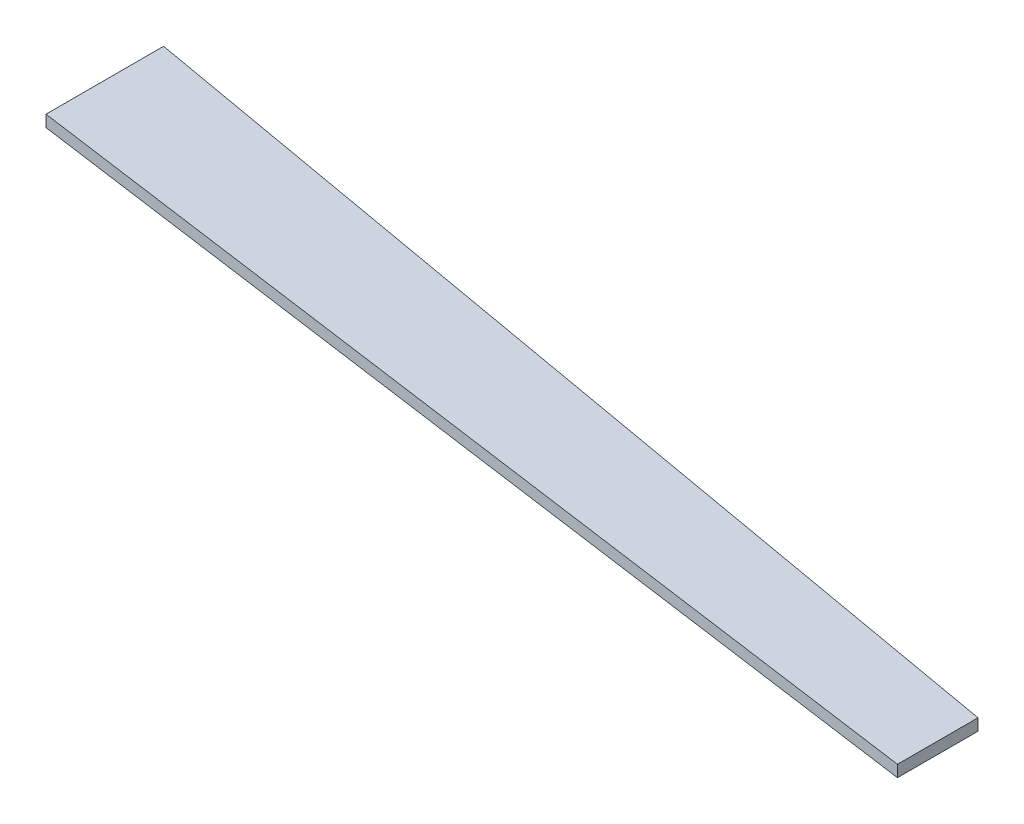
ISO-10303-21;
HEADER;
FILE_DESCRIPTION(('STEP AP214'),'2;1');
FILE_NAME('part.step','',(''),(''),'','','');
FILE_SCHEMA(('AUTOMOTIVE_DESIGN { 1 0 10303 214 1 1 1 1 }'));
ENDSEC;
DATA;
#1=APPLICATION_CONTEXT('core data for automotive mechanical design processes');
#2=APPLICATION_PROTOCOL_DEFINITION('international standard','automotive_design',2000,#1);
#3=PRODUCT_CONTEXT('',#1,'mechanical');
#4=PRODUCT('Part','Part','',(#3));
#5=PRODUCT_RELATED_PRODUCT_CATEGORY('part','',(#4));
#6=PRODUCT_DEFINITION_FORMATION('','',#4);
#7=PRODUCT_DEFINITION_CONTEXT('part definition',#1,'design');
#8=PRODUCT_DEFINITION('design','',#6,#7);
#9=PRODUCT_DEFINITION_SHAPE('','',#8);
#10=(LENGTH_UNIT() NAMED_UNIT(*) SI_UNIT(.MILLI.,.METRE.));
#11=(NAMED_UNIT(*) PLANE_ANGLE_UNIT() SI_UNIT($,.RADIAN.));
#12=(NAMED_UNIT(*) SI_UNIT($,.STERADIAN.) SOLID_ANGLE_UNIT());
#13=UNCERTAINTY_MEASURE_WITH_UNIT(LENGTH_MEASURE(1.E-05),#10,'distance_accuracy_value','');
#14=(GEOMETRIC_REPRESENTATION_CONTEXT(3) GLOBAL_UNCERTAINTY_ASSIGNED_CONTEXT((#13)) GLOBAL_UNIT_ASSIGNED_CONTEXT((#10,
#11,#12)) REPRESENTATION_CONTEXT('',''));
#15=CARTESIAN_POINT('',(0.,0.,0.));
#16=DIRECTION('',(0.,0.,1.));
#17=DIRECTION('',(1.,0.,0.));
#18=AXIS2_PLACEMENT_3D('',#15,#16,#17);
#19=CARTESIAN_POINT('',(104.506252189045,2.,10.3571872638177));
#20=DIRECTION('',(0.137536260349235,0.,-0.990496732497966));
#21=DIRECTION('',(-0.990496732497966,0.,-0.137536260349235));
#22=AXIS2_PLACEMENT_3D('',#19,#20,#21);
#23=PLANE('',#22);
#24=DIRECTION('',(0.990496732497966,0.,0.137536260349235));
#25=VECTOR('',#24,1.);
#26=CARTESIAN_POINT('',(104.506252189045,0.,10.3571872638177));
#27=LINE('',#26,#25);
#28=CARTESIAN_POINT('',(-65.4912621359223,0.,-13.2479611650485));
#29=VERTEX_POINT('',#28);
#30=CARTESIAN_POINT('',(104.506252189045,0.,10.3571872638177));
#31=VERTEX_POINT('',#30);
#32=EDGE_CURVE('E98',#29,#31,#27,.T.);
#33=ORIENTED_EDGE('',*,*,#32,.T.);
#34=DIRECTION('',(0.,-1.,0.));
#35=VECTOR('',#34,1.);
#36=CARTESIAN_POINT('',(104.506252189045,2.,10.3571872638177));
#37=LINE('',#36,#35);
#38=CARTESIAN_POINT('',(104.506252189045,2.,10.3571872638177));
#39=VERTEX_POINT('',#38);
#40=EDGE_CURVE('E11',#39,#31,#37,.T.);
#41=ORIENTED_EDGE('',*,*,#40,.F.);
#42=DIRECTION('',(0.990496732497966,0.,0.137536260349235));
#43=VECTOR('',#42,1.);
#44=CARTESIAN_POINT('',(104.506252189045,2.,10.3571872638177));
#45=LINE('',#44,#43);
#46=CARTESIAN_POINT('',(-65.4912621359223,2.,-13.2479611650485));
#47=VERTEX_POINT('',#46);
#48=EDGE_CURVE('E86',#47,#39,#45,.T.);
#49=ORIENTED_EDGE('',*,*,#48,.F.);
#50=DIRECTION('',(0.,-1.,0.));
#51=VECTOR('',#50,1.);
#52=CARTESIAN_POINT('',(-65.4912621359223,2.,-13.2479611650485));
#53=LINE('',#52,#51);
#54=EDGE_CURVE('E94',#47,#29,#53,.T.);
#55=ORIENTED_EDGE('',*,*,#54,.T.);
#56=EDGE_LOOP('',(#33,#41,#49,#55));
#57=FACE_BOUND('',#56,.T.);
#58=ADVANCED_FACE('F35',(#57),#23,.F.);
#59=CARTESIAN_POINT('',(104.506252189045,2.,-3.49281273618234));
#60=DIRECTION('',(-1.,0.,0.));
#61=DIRECTION('',(0.,0.,1.));
#62=AXIS2_PLACEMENT_3D('',#59,#60,#61);
#63=PLANE('',#62);
#64=DIRECTION('',(0.,0.,-1.));
#65=VECTOR('',#64,1.);
#66=CARTESIAN_POINT('',(104.506252189045,0.,-3.49281273618234));
#67=LINE('',#66,#65);
#68=CARTESIAN_POINT('',(104.506252189045,0.,-3.49281273618234));
#69=VERTEX_POINT('',#68);
#70=EDGE_CURVE('E90',#31,#69,#67,.T.);
#71=ORIENTED_EDGE('',*,*,#70,.T.);
#72=DIRECTION('',(0.,-1.,0.));
#73=VECTOR('',#72,1.);
#74=CARTESIAN_POINT('',(104.506252189045,2.,-3.49281273618234));
#75=LINE('',#74,#73);
#76=CARTESIAN_POINT('',(104.506252189045,2.,-3.49281273618234));
#77=VERTEX_POINT('',#76);
#78=EDGE_CURVE('E43',#77,#69,#75,.T.);
#79=ORIENTED_EDGE('',*,*,#78,.F.);
#80=DIRECTION('',(0.,0.,-1.));
#81=VECTOR('',#80,1.);
#82=CARTESIAN_POINT('',(104.506252189045,2.,-3.49281273618234));
#83=LINE('',#82,#81);
#84=EDGE_CURVE('E81',#39,#77,#83,.T.);
#85=ORIENTED_EDGE('',*,*,#84,.F.);
#86=ORIENTED_EDGE('',*,*,#40,.T.);
#87=EDGE_LOOP('',(#71,#79,#85,#86));
#88=FACE_BOUND('',#87,.T.);
#89=ADVANCED_FACE('F89',(#88),#63,.F.);
#90=CARTESIAN_POINT('',(-65.4912621359223,2.,-33.4679611650485));
#91=DIRECTION('',(-0.173648177666934,0.,0.984807753012207));
#92=DIRECTION('',(0.984807753012208,0.,0.173648177666934));
#93=AXIS2_PLACEMENT_3D('',#90,#91,#92);
#94=PLANE('',#93);
#95=DIRECTION('',(-0.984807753012207,0.,-0.173648177666934));
#96=VECTOR('',#95,1.);
#97=CARTESIAN_POINT('',(-65.4912621359223,0.,-33.4679611650485));
#98=LINE('',#97,#96);
#99=CARTESIAN_POINT('',(-65.4912621359223,0.,-33.4679611650485));
#100=VERTEX_POINT('',#99);
#101=EDGE_CURVE('E68',#69,#100,#98,.T.);
#102=ORIENTED_EDGE('',*,*,#101,.T.);
#103=DIRECTION('',(0.,-1.,0.));
#104=VECTOR('',#103,1.);
#105=CARTESIAN_POINT('',(-65.4912621359223,2.,-33.4679611650485));
#106=LINE('',#105,#104);
#107=CARTESIAN_POINT('',(-65.4912621359223,2.,-33.4679611650485));
#108=VERTEX_POINT('',#107);
#109=EDGE_CURVE('E91',#108,#100,#106,.T.);
#110=ORIENTED_EDGE('',*,*,#109,.F.);
#111=DIRECTION('',(-0.984807753012207,0.,-0.173648177666934));
#112=VECTOR('',#111,1.);
#113=CARTESIAN_POINT('',(-65.4912621359223,2.,-33.4679611650485));
#114=LINE('',#113,#112);
#115=EDGE_CURVE('E84',#77,#108,#114,.T.);
#116=ORIENTED_EDGE('',*,*,#115,.F.);
#117=ORIENTED_EDGE('',*,*,#78,.T.);
#118=EDGE_LOOP('',(#102,#110,#116,#117));
#119=FACE_BOUND('',#118,.T.);
#120=ADVANCED_FACE('F92',(#119),#94,.F.);
#121=CARTESIAN_POINT('',(-65.4912621359223,2.,-13.2479611650485));
#122=DIRECTION('',(1.,0.,0.));
#123=DIRECTION('',(0.,0.,-1.));
#124=AXIS2_PLACEMENT_3D('',#121,#122,#123);
#125=PLANE('',#124);
#126=DIRECTION('',(0.,0.,1.));
#127=VECTOR('',#126,1.);
#128=CARTESIAN_POINT('',(-65.4912621359223,0.,-13.2479611650485));
#129=LINE('',#128,#127);
#130=EDGE_CURVE('E74',#100,#29,#129,.T.);
#131=ORIENTED_EDGE('',*,*,#130,.T.);
#132=ORIENTED_EDGE('',*,*,#54,.F.);
#133=DIRECTION('',(0.,0.,1.));
#134=VECTOR('',#133,1.);
#135=CARTESIAN_POINT('',(-65.4912621359223,2.,-13.2479611650485));
#136=LINE('',#135,#134);
#137=EDGE_CURVE('E51',#108,#47,#136,.T.);
#138=ORIENTED_EDGE('',*,*,#137,.F.);
#139=ORIENTED_EDGE('',*,*,#109,.T.);
#140=EDGE_LOOP('',(#131,#132,#138,#139));
#141=FACE_BOUND('',#140,.T.);
#142=ADVANCED_FACE('F105',(#141),#125,.F.);
#143=CARTESIAN_POINT('',(0.,2.,0.));
#144=DIRECTION('',(0.,-1.,0.));
#145=DIRECTION('',(0.,0.,-1.));
#146=AXIS2_PLACEMENT_3D('',#143,#144,#145);
#147=PLANE('',#146);
#148=ORIENTED_EDGE('',*,*,#48,.T.);
#149=ORIENTED_EDGE('',*,*,#84,.T.);
#150=ORIENTED_EDGE('',*,*,#115,.T.);
#151=ORIENTED_EDGE('',*,*,#137,.T.);
#152=EDGE_LOOP('',(#148,#149,#150,#151));
#153=FACE_BOUND('',#152,.T.);
#154=ADVANCED_FACE('F82',(#153),#147,.F.);
#155=CARTESIAN_POINT('',(0.,0.,0.));
#156=DIRECTION('',(0.,-1.,0.));
#157=DIRECTION('',(0.,0.,-1.));
#158=AXIS2_PLACEMENT_3D('',#155,#156,#157);
#159=PLANE('',#158);
#160=ORIENTED_EDGE('',*,*,#32,.F.);
#161=ORIENTED_EDGE('',*,*,#130,.F.);
#162=ORIENTED_EDGE('',*,*,#101,.F.);
#163=ORIENTED_EDGE('',*,*,#70,.F.);
#164=EDGE_LOOP('',(#160,#161,#162,#163));
#165=FACE_BOUND('',#164,.T.);
#166=ADVANCED_FACE('F108',(#165),#159,.T.);
#167=CLOSED_SHELL('',(#58,#89,#120,#142,#154,#166));
#168=MANIFOLD_SOLID_BREP('B2',#167);
#169=ADVANCED_BREP_SHAPE_REPRESENTATION('',(#18,#168),#14);
#170=SHAPE_DEFINITION_REPRESENTATION(#9,#169);
ENDSEC;
END-ISO-10303-21;
